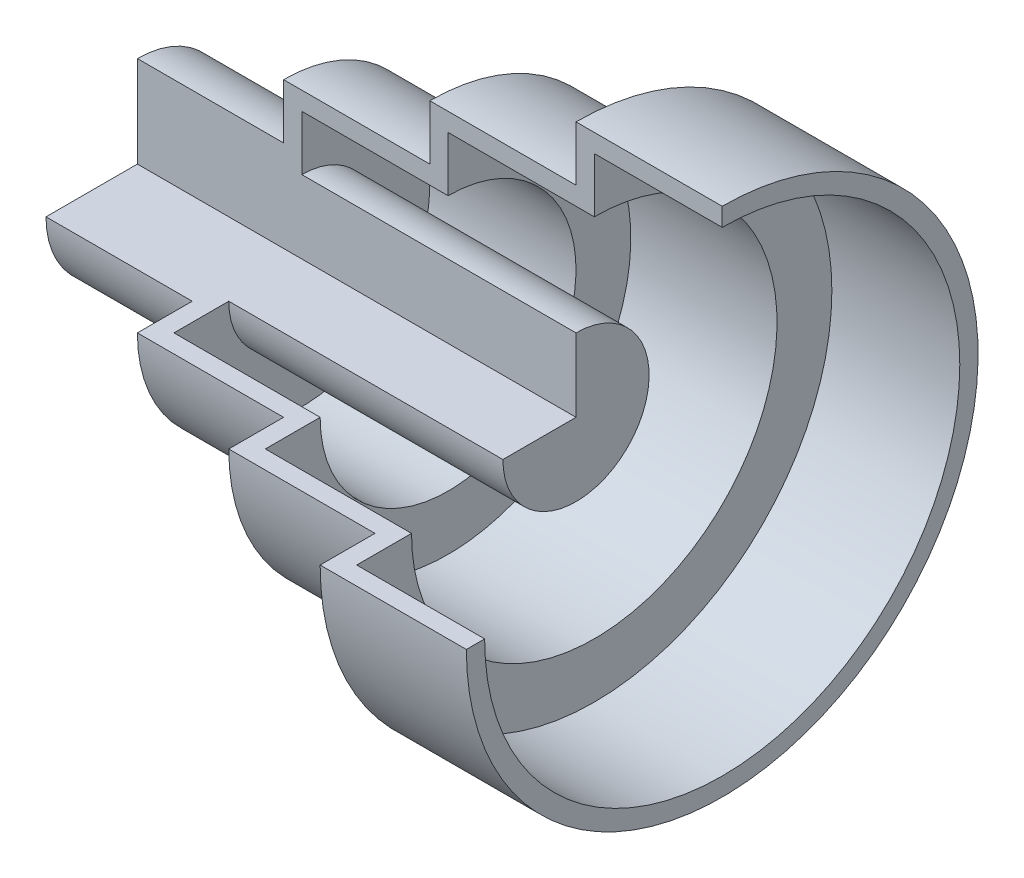
ISO-10303-21;
HEADER;
FILE_DESCRIPTION(('STEP AP214'),'2;1');
FILE_NAME('part.step','',(''),(''),'','','');
FILE_SCHEMA(('AUTOMOTIVE_DESIGN { 1 0 10303 214 1 1 1 1 }'));
ENDSEC;
DATA;
#1=APPLICATION_CONTEXT('core data for automotive mechanical design processes');
#2=APPLICATION_PROTOCOL_DEFINITION('international standard','automotive_design',2000,#1);
#3=PRODUCT_CONTEXT('',#1,'mechanical');
#4=PRODUCT('Part','Part','',(#3));
#5=PRODUCT_RELATED_PRODUCT_CATEGORY('part','',(#4));
#6=PRODUCT_DEFINITION_FORMATION('','',#4);
#7=PRODUCT_DEFINITION_CONTEXT('part definition',#1,'design');
#8=PRODUCT_DEFINITION('design','',#6,#7);
#9=PRODUCT_DEFINITION_SHAPE('','',#8);
#10=(LENGTH_UNIT() NAMED_UNIT(*) SI_UNIT(.MILLI.,.METRE.));
#11=(NAMED_UNIT(*) PLANE_ANGLE_UNIT() SI_UNIT($,.RADIAN.));
#12=(NAMED_UNIT(*) SI_UNIT($,.STERADIAN.) SOLID_ANGLE_UNIT());
#13=UNCERTAINTY_MEASURE_WITH_UNIT(LENGTH_MEASURE(1.E-05),#10,'distance_accuracy_value','');
#14=(GEOMETRIC_REPRESENTATION_CONTEXT(3) GLOBAL_UNCERTAINTY_ASSIGNED_CONTEXT((#13)) GLOBAL_UNIT_ASSIGNED_CONTEXT((#10,
#11,#12)) REPRESENTATION_CONTEXT('',''));
#15=CARTESIAN_POINT('',(0.,0.,0.));
#16=DIRECTION('',(0.,0.,1.));
#17=DIRECTION('',(1.,0.,0.));
#18=AXIS2_PLACEMENT_3D('',#15,#16,#17);
#19=CARTESIAN_POINT('',(120.,0.,0.));
#20=DIRECTION('',(1.,0.,0.));
#21=DIRECTION('',(0.,0.,-1.));
#22=AXIS2_PLACEMENT_3D('',#19,#20,#21);
#23=PLANE('',#22);
#24=CARTESIAN_POINT('',(120.,0.,0.));
#25=DIRECTION('',(1.,0.,0.));
#26=DIRECTION('',(0.,0.,-1.));
#27=AXIS2_PLACEMENT_3D('',#24,#25,#26);
#28=CIRCLE('',#27,20.);
#29=CARTESIAN_POINT('',(120.,2.09488880330588E-13,20.));
#30=VERTEX_POINT('',#29);
#31=CARTESIAN_POINT('',(120.,20.,0.));
#32=VERTEX_POINT('',#31);
#33=EDGE_CURVE('E11',#30,#32,#28,.T.);
#34=ORIENTED_EDGE('',*,*,#33,.T.);
#35=DIRECTION('',(0.,1.,0.));
#36=VECTOR('',#35,1.);
#37=CARTESIAN_POINT('',(120.,0.,0.));
#38=LINE('',#37,#36);
#39=CARTESIAN_POINT('',(120.,0.,0.));
#40=VERTEX_POINT('',#39);
#41=EDGE_CURVE('E58',#40,#32,#38,.T.);
#42=ORIENTED_EDGE('',*,*,#41,.F.);
#43=DIRECTION('',(0.,0.,1.));
#44=VECTOR('',#43,1.);
#45=CARTESIAN_POINT('',(120.,0.,0.));
#46=LINE('',#45,#44);
#47=EDGE_CURVE('E161',#40,#30,#46,.T.);
#48=ORIENTED_EDGE('',*,*,#47,.T.);
#49=EDGE_LOOP('',(#34,#42,#48));
#50=FACE_BOUND('',#49,.T.);
#51=ADVANCED_FACE('F43',(#50),#23,.T.);
#52=CARTESIAN_POINT('',(120.,0.,0.));
#53=DIRECTION('',(1.,0.,0.));
#54=DIRECTION('',(0.,0.,-1.));
#55=AXIS2_PLACEMENT_3D('',#52,#53,#54);
#56=CYLINDRICAL_SURFACE('',#55,20.);
#57=CARTESIAN_POINT('',(45.,0.,0.));
#58=DIRECTION('',(1.,0.,0.));
#59=DIRECTION('',(0.,0.,-1.));
#60=AXIS2_PLACEMENT_3D('',#57,#58,#59);
#61=CIRCLE('',#60,20.);
#62=CARTESIAN_POINT('',(45.,2.09488880330588E-13,20.));
#63=VERTEX_POINT('',#62);
#64=CARTESIAN_POINT('',(45.,20.,0.));
#65=VERTEX_POINT('',#64);
#66=EDGE_CURVE('E52',#63,#65,#61,.T.);
#67=ORIENTED_EDGE('',*,*,#66,.T.);
#68=DIRECTION('',(-1.,0.,0.));
#69=VECTOR('',#68,1.);
#70=CARTESIAN_POINT('',(120.,20.,0.));
#71=LINE('',#70,#69);
#72=EDGE_CURVE('E170',#32,#65,#71,.T.);
#73=ORIENTED_EDGE('',*,*,#72,.F.);
#74=ORIENTED_EDGE('',*,*,#33,.F.);
#75=DIRECTION('',(-1.,0.,0.));
#76=VECTOR('',#75,1.);
#77=CARTESIAN_POINT('',(120.,2.09488880330588E-13,20.));
#78=LINE('',#77,#76);
#79=EDGE_CURVE('E237',#30,#63,#78,.T.);
#80=ORIENTED_EDGE('',*,*,#79,.T.);
#81=EDGE_LOOP('',(#67,#73,#74,#80));
#82=FACE_BOUND('',#81,.T.);
#83=ADVANCED_FACE('F45',(#82),#56,.T.);
#84=CARTESIAN_POINT('',(45.,2.09488880330588E-13,20.));
#85=DIRECTION('',(1.,0.,0.));
#86=DIRECTION('',(0.,0.,-1.));
#87=AXIS2_PLACEMENT_3D('',#84,#85,#86);
#88=PLANE('',#87);
#89=CARTESIAN_POINT('',(45.,0.,0.));
#90=DIRECTION('',(1.,0.,0.));
#91=DIRECTION('',(0.,0.,-1.));
#92=AXIS2_PLACEMENT_3D('',#89,#90,#91);
#93=CIRCLE('',#92,35.);
#94=CARTESIAN_POINT('',(45.,3.66605540578529E-13,35.));
#95=VERTEX_POINT('',#94);
#96=CARTESIAN_POINT('',(45.,35.,0.));
#97=VERTEX_POINT('',#96);
#98=EDGE_CURVE('E341',#95,#97,#93,.T.);
#99=ORIENTED_EDGE('',*,*,#98,.T.);
#100=DIRECTION('',(0.,1.,0.));
#101=VECTOR('',#100,1.);
#102=CARTESIAN_POINT('',(45.,20.,0.));
#103=LINE('',#102,#101);
#104=EDGE_CURVE('E175',#65,#97,#103,.T.);
#105=ORIENTED_EDGE('',*,*,#104,.F.);
#106=ORIENTED_EDGE('',*,*,#66,.F.);
#107=DIRECTION('',(0.,0.,1.));
#108=VECTOR('',#107,1.);
#109=CARTESIAN_POINT('',(45.,2.09488880330588E-13,20.));
#110=LINE('',#109,#108);
#111=EDGE_CURVE('E240',#63,#95,#110,.T.);
#112=ORIENTED_EDGE('',*,*,#111,.T.);
#113=EDGE_LOOP('',(#99,#105,#106,#112));
#114=FACE_BOUND('',#113,.T.);
#115=ADVANCED_FACE('F345',(#114),#88,.T.);
#116=CARTESIAN_POINT('',(120.,0.,0.));
#117=DIRECTION('',(1.,0.,0.));
#118=DIRECTION('',(0.,0.,-1.));
#119=AXIS2_PLACEMENT_3D('',#116,#117,#118);
#120=CYLINDRICAL_SURFACE('',#119,35.);
#121=CARTESIAN_POINT('',(85.,0.,0.));
#122=DIRECTION('',(1.,0.,0.));
#123=DIRECTION('',(0.,0.,-1.));
#124=AXIS2_PLACEMENT_3D('',#121,#122,#123);
#125=CIRCLE('',#124,35.);
#126=CARTESIAN_POINT('',(85.,3.66605540578529E-13,35.));
#127=VERTEX_POINT('',#126);
#128=CARTESIAN_POINT('',(85.,35.,0.));
#129=VERTEX_POINT('',#128);
#130=EDGE_CURVE('E338',#127,#129,#125,.T.);
#131=ORIENTED_EDGE('',*,*,#130,.T.);
#132=DIRECTION('',(1.,0.,0.));
#133=VECTOR('',#132,1.);
#134=CARTESIAN_POINT('',(85.,35.,0.));
#135=LINE('',#134,#133);
#136=EDGE_CURVE('E178',#97,#129,#135,.T.);
#137=ORIENTED_EDGE('',*,*,#136,.F.);
#138=ORIENTED_EDGE('',*,*,#98,.F.);
#139=DIRECTION('',(1.,0.,0.));
#140=VECTOR('',#139,1.);
#141=CARTESIAN_POINT('',(85.,3.66605540578529E-13,35.));
#142=LINE('',#141,#140);
#143=EDGE_CURVE('E244',#95,#127,#142,.T.);
#144=ORIENTED_EDGE('',*,*,#143,.T.);
#145=EDGE_LOOP('',(#131,#137,#138,#144));
#146=FACE_BOUND('',#145,.T.);
#147=ADVANCED_FACE('F351',(#146),#120,.F.);
#148=CARTESIAN_POINT('',(85.,3.66605540578529E-13,35.));
#149=DIRECTION('',(1.,0.,0.));
#150=DIRECTION('',(0.,0.,-1.));
#151=AXIS2_PLACEMENT_3D('',#148,#149,#150);
#152=PLANE('',#151);
#153=CARTESIAN_POINT('',(85.,0.,0.));
#154=DIRECTION('',(1.,0.,0.));
#155=DIRECTION('',(0.,0.,-1.));
#156=AXIS2_PLACEMENT_3D('',#153,#154,#155);
#157=CIRCLE('',#156,50.);
#158=CARTESIAN_POINT('',(85.,5.2372220082647E-13,50.));
#159=VERTEX_POINT('',#158);
#160=CARTESIAN_POINT('',(85.,50.,0.));
#161=VERTEX_POINT('',#160);
#162=EDGE_CURVE('E335',#159,#161,#157,.T.);
#163=ORIENTED_EDGE('',*,*,#162,.T.);
#164=DIRECTION('',(0.,1.,0.));
#165=VECTOR('',#164,1.);
#166=CARTESIAN_POINT('',(85.,35.,0.));
#167=LINE('',#166,#165);
#168=EDGE_CURVE('E184',#129,#161,#167,.T.);
#169=ORIENTED_EDGE('',*,*,#168,.F.);
#170=ORIENTED_EDGE('',*,*,#130,.F.);
#171=DIRECTION('',(0.,0.,1.));
#172=VECTOR('',#171,1.);
#173=CARTESIAN_POINT('',(85.,3.66605540578529E-13,35.));
#174=LINE('',#173,#172);
#175=EDGE_CURVE('E248',#127,#159,#174,.T.);
#176=ORIENTED_EDGE('',*,*,#175,.T.);
#177=EDGE_LOOP('',(#163,#169,#170,#176));
#178=FACE_BOUND('',#177,.T.);
#179=ADVANCED_FACE('F354',(#178),#152,.T.);
#180=CARTESIAN_POINT('',(120.,0.,0.));
#181=DIRECTION('',(1.,0.,0.));
#182=DIRECTION('',(0.,0.,-1.));
#183=AXIS2_PLACEMENT_3D('',#180,#181,#182);
#184=CYLINDRICAL_SURFACE('',#183,50.);
#185=CARTESIAN_POINT('',(125.,0.,0.));
#186=DIRECTION('',(1.,0.,0.));
#187=DIRECTION('',(0.,0.,-1.));
#188=AXIS2_PLACEMENT_3D('',#185,#186,#187);
#189=CIRCLE('',#188,50.);
#190=CARTESIAN_POINT('',(125.,5.2372220082647E-13,50.));
#191=VERTEX_POINT('',#190);
#192=CARTESIAN_POINT('',(125.,50.,0.));
#193=VERTEX_POINT('',#192);
#194=EDGE_CURVE('E332',#191,#193,#189,.T.);
#195=ORIENTED_EDGE('',*,*,#194,.T.);
#196=DIRECTION('',(1.,0.,0.));
#197=VECTOR('',#196,1.);
#198=CARTESIAN_POINT('',(125.,50.,0.));
#199=LINE('',#198,#197);
#200=EDGE_CURVE('E188',#161,#193,#199,.T.);
#201=ORIENTED_EDGE('',*,*,#200,.F.);
#202=ORIENTED_EDGE('',*,*,#162,.F.);
#203=DIRECTION('',(1.,0.,0.));
#204=VECTOR('',#203,1.);
#205=CARTESIAN_POINT('',(125.,5.2372220082647E-13,50.));
#206=LINE('',#205,#204);
#207=EDGE_CURVE('E252',#159,#191,#206,.T.);
#208=ORIENTED_EDGE('',*,*,#207,.T.);
#209=EDGE_LOOP('',(#195,#201,#202,#208));
#210=FACE_BOUND('',#209,.T.);
#211=ADVANCED_FACE('F359',(#210),#184,.F.);
#212=CARTESIAN_POINT('',(125.,6.80838861074411E-13,65.));
#213=DIRECTION('',(1.,0.,0.));
#214=DIRECTION('',(0.,0.,-1.));
#215=AXIS2_PLACEMENT_3D('',#212,#213,#214);
#216=PLANE('',#215);
#217=CARTESIAN_POINT('',(125.,0.,0.));
#218=DIRECTION('',(1.,0.,0.));
#219=DIRECTION('',(0.,0.,-1.));
#220=AXIS2_PLACEMENT_3D('',#217,#218,#219);
#221=CIRCLE('',#220,65.);
#222=CARTESIAN_POINT('',(125.,6.80838861074411E-13,65.));
#223=VERTEX_POINT('',#222);
#224=CARTESIAN_POINT('',(125.,65.,0.));
#225=VERTEX_POINT('',#224);
#226=EDGE_CURVE('E329',#223,#225,#221,.T.);
#227=ORIENTED_EDGE('',*,*,#226,.T.);
#228=DIRECTION('',(0.,1.,0.));
#229=VECTOR('',#228,1.);
#230=CARTESIAN_POINT('',(125.,65.,0.));
#231=LINE('',#230,#229);
#232=EDGE_CURVE('E192',#193,#225,#231,.T.);
#233=ORIENTED_EDGE('',*,*,#232,.F.);
#234=ORIENTED_EDGE('',*,*,#194,.F.);
#235=DIRECTION('',(0.,0.,1.));
#236=VECTOR('',#235,1.);
#237=CARTESIAN_POINT('',(125.,6.80838861074411E-13,65.));
#238=LINE('',#237,#236);
#239=EDGE_CURVE('E256',#191,#223,#238,.T.);
#240=ORIENTED_EDGE('',*,*,#239,.T.);
#241=EDGE_LOOP('',(#227,#233,#234,#240));
#242=FACE_BOUND('',#241,.T.);
#243=ADVANCED_FACE('F362',(#242),#216,.T.);
#244=CARTESIAN_POINT('',(120.,0.,0.));
#245=DIRECTION('',(1.,0.,0.));
#246=DIRECTION('',(0.,0.,-1.));
#247=AXIS2_PLACEMENT_3D('',#244,#245,#246);
#248=CYLINDRICAL_SURFACE('',#247,65.);
#249=CARTESIAN_POINT('',(160.,0.,0.));
#250=DIRECTION('',(1.,0.,0.));
#251=DIRECTION('',(0.,0.,-1.));
#252=AXIS2_PLACEMENT_3D('',#249,#250,#251);
#253=CIRCLE('',#252,65.);
#254=CARTESIAN_POINT('',(160.,6.80838861074411E-13,65.));
#255=VERTEX_POINT('',#254);
#256=CARTESIAN_POINT('',(160.,65.,0.));
#257=VERTEX_POINT('',#256);
#258=EDGE_CURVE('E326',#255,#257,#253,.T.);
#259=ORIENTED_EDGE('',*,*,#258,.T.);
#260=DIRECTION('',(1.,0.,0.));
#261=VECTOR('',#260,1.);
#262=CARTESIAN_POINT('',(160.,65.,0.));
#263=LINE('',#262,#261);
#264=EDGE_CURVE('E196',#225,#257,#263,.T.);
#265=ORIENTED_EDGE('',*,*,#264,.F.);
#266=ORIENTED_EDGE('',*,*,#226,.F.);
#267=DIRECTION('',(1.,0.,0.));
#268=VECTOR('',#267,1.);
#269=CARTESIAN_POINT('',(160.,6.80838861074411E-13,65.));
#270=LINE('',#269,#268);
#271=EDGE_CURVE('E260',#223,#255,#270,.T.);
#272=ORIENTED_EDGE('',*,*,#271,.T.);
#273=EDGE_LOOP('',(#259,#265,#266,#272));
#274=FACE_BOUND('',#273,.T.);
#275=ADVANCED_FACE('F367',(#274),#248,.F.);
#276=CARTESIAN_POINT('',(160.,7.33211081157058E-13,70.));
#277=DIRECTION('',(1.,0.,0.));
#278=DIRECTION('',(0.,0.,-1.));
#279=AXIS2_PLACEMENT_3D('',#276,#277,#278);
#280=PLANE('',#279);
#281=CARTESIAN_POINT('',(160.,0.,0.));
#282=DIRECTION('',(1.,0.,0.));
#283=DIRECTION('',(0.,0.,-1.));
#284=AXIS2_PLACEMENT_3D('',#281,#282,#283);
#285=CIRCLE('',#284,70.);
#286=CARTESIAN_POINT('',(160.,7.33211081157058E-13,70.));
#287=VERTEX_POINT('',#286);
#288=CARTESIAN_POINT('',(160.,70.,0.));
#289=VERTEX_POINT('',#288);
#290=EDGE_CURVE('E323',#287,#289,#285,.T.);
#291=ORIENTED_EDGE('',*,*,#290,.T.);
#292=DIRECTION('',(0.,1.,0.));
#293=VECTOR('',#292,1.);
#294=CARTESIAN_POINT('',(160.,70.,0.));
#295=LINE('',#294,#293);
#296=EDGE_CURVE('E200',#257,#289,#295,.T.);
#297=ORIENTED_EDGE('',*,*,#296,.F.);
#298=ORIENTED_EDGE('',*,*,#258,.F.);
#299=DIRECTION('',(0.,0.,1.));
#300=VECTOR('',#299,1.);
#301=CARTESIAN_POINT('',(160.,7.33211081157058E-13,70.));
#302=LINE('',#301,#300);
#303=EDGE_CURVE('E264',#255,#287,#302,.T.);
#304=ORIENTED_EDGE('',*,*,#303,.T.);
#305=EDGE_LOOP('',(#291,#297,#298,#304));
#306=FACE_BOUND('',#305,.T.);
#307=ADVANCED_FACE('F370',(#306),#280,.T.);
#308=CARTESIAN_POINT('',(120.,0.,0.));
#309=DIRECTION('',(1.,0.,0.));
#310=DIRECTION('',(0.,0.,-1.));
#311=AXIS2_PLACEMENT_3D('',#308,#309,#310);
#312=CYLINDRICAL_SURFACE('',#311,70.);
#313=CARTESIAN_POINT('',(120.,0.,0.));
#314=DIRECTION('',(1.,0.,0.));
#315=DIRECTION('',(0.,0.,-1.));
#316=AXIS2_PLACEMENT_3D('',#313,#314,#315);
#317=CIRCLE('',#316,70.);
#318=CARTESIAN_POINT('',(120.,7.33211081157058E-13,70.));
#319=VERTEX_POINT('',#318);
#320=CARTESIAN_POINT('',(120.,70.,0.));
#321=VERTEX_POINT('',#320);
#322=EDGE_CURVE('E320',#319,#321,#317,.T.);
#323=ORIENTED_EDGE('',*,*,#322,.T.);
#324=DIRECTION('',(-1.,0.,0.));
#325=VECTOR('',#324,1.);
#326=CARTESIAN_POINT('',(120.,70.,0.));
#327=LINE('',#326,#325);
#328=EDGE_CURVE('E204',#289,#321,#327,.T.);
#329=ORIENTED_EDGE('',*,*,#328,.F.);
#330=ORIENTED_EDGE('',*,*,#290,.F.);
#331=DIRECTION('',(-1.,0.,0.));
#332=VECTOR('',#331,1.);
#333=CARTESIAN_POINT('',(120.,7.33211081157058E-13,70.));
#334=LINE('',#333,#332);
#335=EDGE_CURVE('E268',#287,#319,#334,.T.);
#336=ORIENTED_EDGE('',*,*,#335,.T.);
#337=EDGE_LOOP('',(#323,#329,#330,#336));
#338=FACE_BOUND('',#337,.T.);
#339=ADVANCED_FACE('F375',(#338),#312,.T.);
#340=CARTESIAN_POINT('',(120.,5.76094420909117E-13,55.));
#341=DIRECTION('',(-1.,0.,0.));
#342=DIRECTION('',(0.,0.,1.));
#343=AXIS2_PLACEMENT_3D('',#340,#341,#342);
#344=PLANE('',#343);
#345=CARTESIAN_POINT('',(120.,0.,0.));
#346=DIRECTION('',(1.,0.,0.));
#347=DIRECTION('',(0.,0.,-1.));
#348=AXIS2_PLACEMENT_3D('',#345,#346,#347);
#349=CIRCLE('',#348,55.);
#350=CARTESIAN_POINT('',(120.,5.76094420909117E-13,55.));
#351=VERTEX_POINT('',#350);
#352=CARTESIAN_POINT('',(120.,55.,0.));
#353=VERTEX_POINT('',#352);
#354=EDGE_CURVE('E317',#351,#353,#349,.T.);
#355=ORIENTED_EDGE('',*,*,#354,.T.);
#356=DIRECTION('',(0.,-1.,0.));
#357=VECTOR('',#356,1.);
#358=CARTESIAN_POINT('',(120.,55.,0.));
#359=LINE('',#358,#357);
#360=EDGE_CURVE('E208',#321,#353,#359,.T.);
#361=ORIENTED_EDGE('',*,*,#360,.F.);
#362=ORIENTED_EDGE('',*,*,#322,.F.);
#363=DIRECTION('',(0.,0.,-1.));
#364=VECTOR('',#363,1.);
#365=CARTESIAN_POINT('',(120.,5.76094420909117E-13,55.));
#366=LINE('',#365,#364);
#367=EDGE_CURVE('E272',#319,#351,#366,.T.);
#368=ORIENTED_EDGE('',*,*,#367,.T.);
#369=EDGE_LOOP('',(#355,#361,#362,#368));
#370=FACE_BOUND('',#369,.T.);
#371=ADVANCED_FACE('F378',(#370),#344,.T.);
#372=CARTESIAN_POINT('',(120.,0.,0.));
#373=DIRECTION('',(1.,0.,0.));
#374=DIRECTION('',(0.,0.,-1.));
#375=AXIS2_PLACEMENT_3D('',#372,#373,#374);
#376=CYLINDRICAL_SURFACE('',#375,55.);
#377=CARTESIAN_POINT('',(80.,0.,0.));
#378=DIRECTION('',(1.,0.,0.));
#379=DIRECTION('',(0.,0.,-1.));
#380=AXIS2_PLACEMENT_3D('',#377,#378,#379);
#381=CIRCLE('',#380,55.);
#382=CARTESIAN_POINT('',(80.,5.76094420909117E-13,55.));
#383=VERTEX_POINT('',#382);
#384=CARTESIAN_POINT('',(80.,55.,0.));
#385=VERTEX_POINT('',#384);
#386=EDGE_CURVE('E314',#383,#385,#381,.T.);
#387=ORIENTED_EDGE('',*,*,#386,.T.);
#388=DIRECTION('',(-1.,0.,0.));
#389=VECTOR('',#388,1.);
#390=CARTESIAN_POINT('',(120.,55.,0.));
#391=LINE('',#390,#389);
#392=EDGE_CURVE('E212',#353,#385,#391,.T.);
#393=ORIENTED_EDGE('',*,*,#392,.F.);
#394=ORIENTED_EDGE('',*,*,#354,.F.);
#395=DIRECTION('',(-1.,0.,0.));
#396=VECTOR('',#395,1.);
#397=CARTESIAN_POINT('',(120.,5.76094420909117E-13,55.));
#398=LINE('',#397,#396);
#399=EDGE_CURVE('E276',#351,#383,#398,.T.);
#400=ORIENTED_EDGE('',*,*,#399,.T.);
#401=EDGE_LOOP('',(#387,#393,#394,#400));
#402=FACE_BOUND('',#401,.T.);
#403=ADVANCED_FACE('F383',(#402),#376,.T.);
#404=CARTESIAN_POINT('',(80.,5.76094420909117E-13,55.));
#405=DIRECTION('',(-1.,0.,0.));
#406=DIRECTION('',(0.,0.,1.));
#407=AXIS2_PLACEMENT_3D('',#404,#405,#406);
#408=PLANE('',#407);
#409=CARTESIAN_POINT('',(80.,0.,0.));
#410=DIRECTION('',(1.,0.,0.));
#411=DIRECTION('',(0.,0.,-1.));
#412=AXIS2_PLACEMENT_3D('',#409,#410,#411);
#413=CIRCLE('',#412,40.);
#414=CARTESIAN_POINT('',(80.,4.18977760661176E-13,40.));
#415=VERTEX_POINT('',#414);
#416=CARTESIAN_POINT('',(80.,40.,0.));
#417=VERTEX_POINT('',#416);
#418=EDGE_CURVE('E311',#415,#417,#413,.T.);
#419=ORIENTED_EDGE('',*,*,#418,.T.);
#420=DIRECTION('',(0.,-1.,0.));
#421=VECTOR('',#420,1.);
#422=CARTESIAN_POINT('',(80.,55.,0.));
#423=LINE('',#422,#421);
#424=EDGE_CURVE('E216',#385,#417,#423,.T.);
#425=ORIENTED_EDGE('',*,*,#424,.F.);
#426=ORIENTED_EDGE('',*,*,#386,.F.);
#427=DIRECTION('',(0.,0.,-1.));
#428=VECTOR('',#427,1.);
#429=CARTESIAN_POINT('',(80.,5.76094420909117E-13,55.));
#430=LINE('',#429,#428);
#431=EDGE_CURVE('E280',#383,#415,#430,.T.);
#432=ORIENTED_EDGE('',*,*,#431,.T.);
#433=EDGE_LOOP('',(#419,#425,#426,#432));
#434=FACE_BOUND('',#433,.T.);
#435=ADVANCED_FACE('F386',(#434),#408,.T.);
#436=CARTESIAN_POINT('',(120.,0.,0.));
#437=DIRECTION('',(1.,0.,0.));
#438=DIRECTION('',(0.,0.,-1.));
#439=AXIS2_PLACEMENT_3D('',#436,#437,#438);
#440=CYLINDRICAL_SURFACE('',#439,40.);
#441=CARTESIAN_POINT('',(40.,0.,0.));
#442=DIRECTION('',(1.,0.,0.));
#443=DIRECTION('',(0.,0.,-1.));
#444=AXIS2_PLACEMENT_3D('',#441,#442,#443);
#445=CIRCLE('',#444,40.);
#446=CARTESIAN_POINT('',(40.,4.18977760661176E-13,40.));
#447=VERTEX_POINT('',#446);
#448=CARTESIAN_POINT('',(40.,40.,0.));
#449=VERTEX_POINT('',#448);
#450=EDGE_CURVE('E308',#447,#449,#445,.T.);
#451=ORIENTED_EDGE('',*,*,#450,.T.);
#452=DIRECTION('',(-1.,0.,0.));
#453=VECTOR('',#452,1.);
#454=CARTESIAN_POINT('',(80.,40.,0.));
#455=LINE('',#454,#453);
#456=EDGE_CURVE('E220',#417,#449,#455,.T.);
#457=ORIENTED_EDGE('',*,*,#456,.F.);
#458=ORIENTED_EDGE('',*,*,#418,.F.);
#459=DIRECTION('',(-1.,0.,0.));
#460=VECTOR('',#459,1.);
#461=CARTESIAN_POINT('',(80.,4.18977760661176E-13,40.));
#462=LINE('',#461,#460);
#463=EDGE_CURVE('E284',#415,#447,#462,.T.);
#464=ORIENTED_EDGE('',*,*,#463,.T.);
#465=EDGE_LOOP('',(#451,#457,#458,#464));
#466=FACE_BOUND('',#465,.T.);
#467=ADVANCED_FACE('F391',(#466),#440,.T.);
#468=CARTESIAN_POINT('',(40.,2.61861100413235E-13,25.));
#469=DIRECTION('',(-1.,0.,0.));
#470=DIRECTION('',(0.,0.,1.));
#471=AXIS2_PLACEMENT_3D('',#468,#469,#470);
#472=PLANE('',#471);
#473=CARTESIAN_POINT('',(40.,0.,0.));
#474=DIRECTION('',(1.,0.,0.));
#475=DIRECTION('',(0.,0.,-1.));
#476=AXIS2_PLACEMENT_3D('',#473,#474,#475);
#477=CIRCLE('',#476,25.);
#478=CARTESIAN_POINT('',(40.,2.61861100413235E-13,25.));
#479=VERTEX_POINT('',#478);
#480=CARTESIAN_POINT('',(40.,25.,0.));
#481=VERTEX_POINT('',#480);
#482=EDGE_CURVE('E305',#479,#481,#477,.T.);
#483=ORIENTED_EDGE('',*,*,#482,.T.);
#484=DIRECTION('',(0.,-1.,0.));
#485=VECTOR('',#484,1.);
#486=CARTESIAN_POINT('',(40.,25.,0.));
#487=LINE('',#486,#485);
#488=EDGE_CURVE('E224',#449,#481,#487,.T.);
#489=ORIENTED_EDGE('',*,*,#488,.F.);
#490=ORIENTED_EDGE('',*,*,#450,.F.);
#491=DIRECTION('',(0.,0.,-1.));
#492=VECTOR('',#491,1.);
#493=CARTESIAN_POINT('',(40.,2.61861100413235E-13,25.));
#494=LINE('',#493,#492);
#495=EDGE_CURVE('E288',#447,#479,#494,.T.);
#496=ORIENTED_EDGE('',*,*,#495,.T.);
#497=EDGE_LOOP('',(#483,#489,#490,#496));
#498=FACE_BOUND('',#497,.T.);
#499=ADVANCED_FACE('F394',(#498),#472,.T.);
#500=CARTESIAN_POINT('',(120.,0.,0.));
#501=DIRECTION('',(1.,0.,0.));
#502=DIRECTION('',(0.,0.,-1.));
#503=AXIS2_PLACEMENT_3D('',#500,#501,#502);
#504=CYLINDRICAL_SURFACE('',#503,25.);
#505=CARTESIAN_POINT('',(0.,0.,0.));
#506=DIRECTION('',(1.,0.,0.));
#507=DIRECTION('',(0.,0.,-1.));
#508=AXIS2_PLACEMENT_3D('',#505,#506,#507);
#509=CIRCLE('',#508,25.);
#510=CARTESIAN_POINT('',(0.,2.61861100413235E-13,25.));
#511=VERTEX_POINT('',#510);
#512=CARTESIAN_POINT('',(0.,25.,0.));
#513=VERTEX_POINT('',#512);
#514=EDGE_CURVE('E302',#511,#513,#509,.T.);
#515=ORIENTED_EDGE('',*,*,#514,.T.);
#516=DIRECTION('',(-1.,0.,0.));
#517=VECTOR('',#516,1.);
#518=CARTESIAN_POINT('',(0.,25.,0.));
#519=LINE('',#518,#517);
#520=EDGE_CURVE('E228',#481,#513,#519,.T.);
#521=ORIENTED_EDGE('',*,*,#520,.F.);
#522=ORIENTED_EDGE('',*,*,#482,.F.);
#523=DIRECTION('',(-1.,0.,0.));
#524=VECTOR('',#523,1.);
#525=CARTESIAN_POINT('',(0.,2.61861100413235E-13,25.));
#526=LINE('',#525,#524);
#527=EDGE_CURVE('E292',#479,#511,#526,.T.);
#528=ORIENTED_EDGE('',*,*,#527,.T.);
#529=EDGE_LOOP('',(#515,#521,#522,#528));
#530=FACE_BOUND('',#529,.T.);
#531=ADVANCED_FACE('F399',(#530),#504,.T.);
#532=CARTESIAN_POINT('',(0.,0.,0.));
#533=DIRECTION('',(-1.,0.,0.));
#534=DIRECTION('',(0.,0.,1.));
#535=AXIS2_PLACEMENT_3D('',#532,#533,#534);
#536=PLANE('',#535);
#537=DIRECTION('',(0.,-1.,0.));
#538=VECTOR('',#537,1.);
#539=CARTESIAN_POINT('',(0.,0.,0.));
#540=LINE('',#539,#538);
#541=CARTESIAN_POINT('',(0.,0.,0.));
#542=VERTEX_POINT('',#541);
#543=EDGE_CURVE('E232',#513,#542,#540,.T.);
#544=ORIENTED_EDGE('',*,*,#543,.F.);
#545=ORIENTED_EDGE('',*,*,#514,.F.);
#546=DIRECTION('',(0.,0.,-1.));
#547=VECTOR('',#546,1.);
#548=CARTESIAN_POINT('',(0.,0.,0.));
#549=LINE('',#548,#547);
#550=EDGE_CURVE('E296',#511,#542,#549,.T.);
#551=ORIENTED_EDGE('',*,*,#550,.T.);
#552=EDGE_LOOP('',(#544,#545,#551));
#553=FACE_BOUND('',#552,.T.);
#554=ADVANCED_FACE('F401',(#553),#536,.T.);
#555=CARTESIAN_POINT('',(0.,0.,0.));
#556=DIRECTION('',(0.,-1.,0.));
#557=DIRECTION('',(1.,0.,0.));
#558=AXIS2_PLACEMENT_3D('',#555,#556,#557);
#559=PLANE('',#558);
#560=ORIENTED_EDGE('',*,*,#47,.F.);
#561=DIRECTION('',(1.,0.,0.));
#562=VECTOR('',#561,1.);
#563=CARTESIAN_POINT('',(120.,0.,0.));
#564=LINE('',#563,#562);
#565=EDGE_CURVE('E65',#542,#40,#564,.T.);
#566=ORIENTED_EDGE('',*,*,#565,.F.);
#567=ORIENTED_EDGE('',*,*,#550,.F.);
#568=ORIENTED_EDGE('',*,*,#527,.F.);
#569=ORIENTED_EDGE('',*,*,#495,.F.);
#570=ORIENTED_EDGE('',*,*,#463,.F.);
#571=ORIENTED_EDGE('',*,*,#431,.F.);
#572=ORIENTED_EDGE('',*,*,#399,.F.);
#573=ORIENTED_EDGE('',*,*,#367,.F.);
#574=ORIENTED_EDGE('',*,*,#335,.F.);
#575=ORIENTED_EDGE('',*,*,#303,.F.);
#576=ORIENTED_EDGE('',*,*,#271,.F.);
#577=ORIENTED_EDGE('',*,*,#239,.F.);
#578=ORIENTED_EDGE('',*,*,#207,.F.);
#579=ORIENTED_EDGE('',*,*,#175,.F.);
#580=ORIENTED_EDGE('',*,*,#143,.F.);
#581=ORIENTED_EDGE('',*,*,#111,.F.);
#582=ORIENTED_EDGE('',*,*,#79,.F.);
#583=EDGE_LOOP('',(#560,#566,#567,#568,#569,#570,#571,#572,#573,#574,#575,#576,#577,#578,#579,
#580,#581,#582));
#584=FACE_BOUND('',#583,.T.);
#585=ADVANCED_FACE('F402',(#584),#559,.F.);
#586=CARTESIAN_POINT('',(0.,0.,0.));
#587=DIRECTION('',(0.,0.,1.));
#588=DIRECTION('',(1.,0.,0.));
#589=AXIS2_PLACEMENT_3D('',#586,#587,#588);
#590=PLANE('',#589);
#591=ORIENTED_EDGE('',*,*,#41,.T.);
#592=ORIENTED_EDGE('',*,*,#72,.T.);
#593=ORIENTED_EDGE('',*,*,#104,.T.);
#594=ORIENTED_EDGE('',*,*,#136,.T.);
#595=ORIENTED_EDGE('',*,*,#168,.T.);
#596=ORIENTED_EDGE('',*,*,#200,.T.);
#597=ORIENTED_EDGE('',*,*,#232,.T.);
#598=ORIENTED_EDGE('',*,*,#264,.T.);
#599=ORIENTED_EDGE('',*,*,#296,.T.);
#600=ORIENTED_EDGE('',*,*,#328,.T.);
#601=ORIENTED_EDGE('',*,*,#360,.T.);
#602=ORIENTED_EDGE('',*,*,#392,.T.);
#603=ORIENTED_EDGE('',*,*,#424,.T.);
#604=ORIENTED_EDGE('',*,*,#456,.T.);
#605=ORIENTED_EDGE('',*,*,#488,.T.);
#606=ORIENTED_EDGE('',*,*,#520,.T.);
#607=ORIENTED_EDGE('',*,*,#543,.T.);
#608=ORIENTED_EDGE('',*,*,#565,.T.);
#609=EDGE_LOOP('',(#591,#592,#593,#594,#595,#596,#597,#598,#599,#600,#601,#602,#603,#604,#605,
#606,#607,#608));
#610=FACE_BOUND('',#609,.T.);
#611=ADVANCED_FACE('F168',(#610),#590,.T.);
#612=CLOSED_SHELL('',(#51,#83,#115,#147,#179,#211,#243,#275,#307,#339,#371,#403,#435,#467,#499,
#531,#554,#585,#611));
#613=MANIFOLD_SOLID_BREP('B2',#612);
#614=ADVANCED_BREP_SHAPE_REPRESENTATION('',(#18,#613),#14);
#615=SHAPE_DEFINITION_REPRESENTATION(#9,#614);
ENDSEC;
END-ISO-10303-21;
